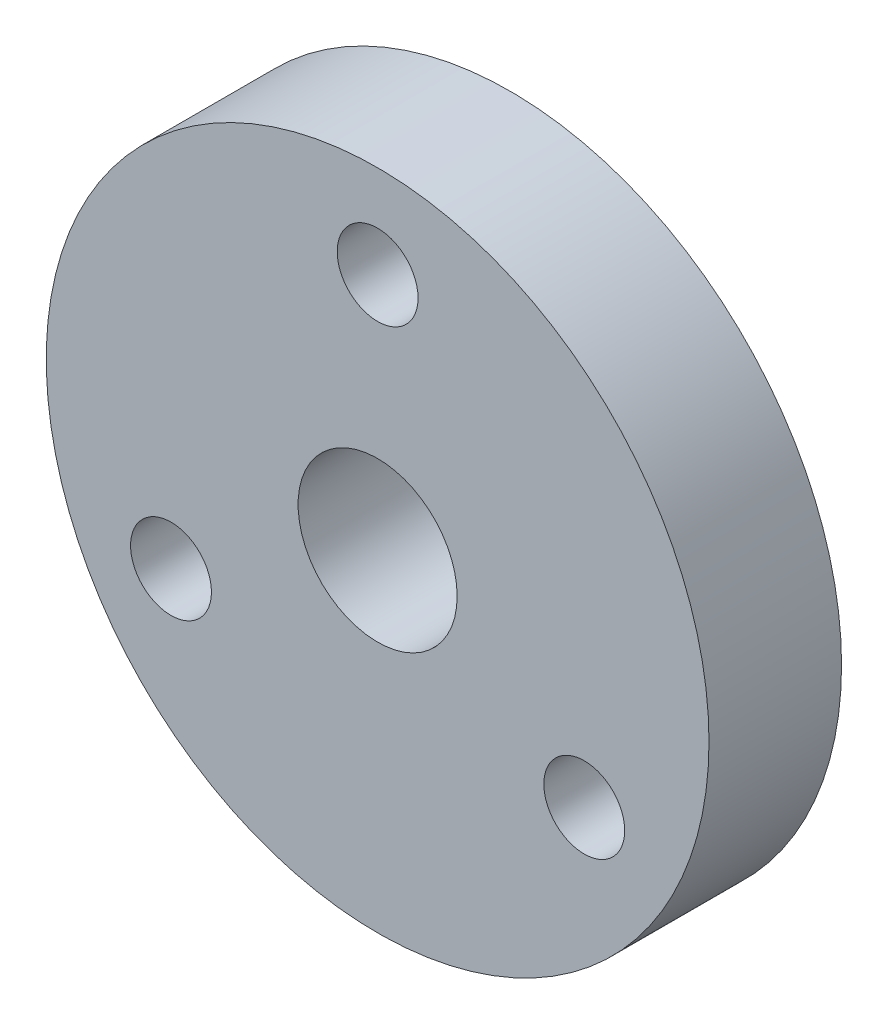
ISO-10303-21;
HEADER;
FILE_DESCRIPTION(('STEP AP214'),'2;1');
FILE_NAME('part.step','',(''),(''),'','','');
FILE_SCHEMA(('AUTOMOTIVE_DESIGN { 1 0 10303 214 1 1 1 1 }'));
ENDSEC;
DATA;
#1=APPLICATION_CONTEXT('core data for automotive mechanical design processes');
#2=APPLICATION_PROTOCOL_DEFINITION('international standard','automotive_design',2000,#1);
#3=PRODUCT_CONTEXT('',#1,'mechanical');
#4=PRODUCT('Part','Part','',(#3));
#5=PRODUCT_RELATED_PRODUCT_CATEGORY('part','',(#4));
#6=PRODUCT_DEFINITION_FORMATION('','',#4);
#7=PRODUCT_DEFINITION_CONTEXT('part definition',#1,'design');
#8=PRODUCT_DEFINITION('design','',#6,#7);
#9=PRODUCT_DEFINITION_SHAPE('','',#8);
#10=(LENGTH_UNIT() NAMED_UNIT(*) SI_UNIT(.MILLI.,.METRE.));
#11=(NAMED_UNIT(*) PLANE_ANGLE_UNIT() SI_UNIT($,.RADIAN.));
#12=(NAMED_UNIT(*) SI_UNIT($,.STERADIAN.) SOLID_ANGLE_UNIT());
#13=UNCERTAINTY_MEASURE_WITH_UNIT(LENGTH_MEASURE(1.E-05),#10,'distance_accuracy_value','');
#14=(GEOMETRIC_REPRESENTATION_CONTEXT(3) GLOBAL_UNCERTAINTY_ASSIGNED_CONTEXT((#13)) GLOBAL_UNIT_ASSIGNED_CONTEXT((#10,
#11,#12)) REPRESENTATION_CONTEXT('',''));
#15=CARTESIAN_POINT('',(0.,0.,0.));
#16=DIRECTION('',(0.,0.,1.));
#17=DIRECTION('',(1.,0.,0.));
#18=AXIS2_PLACEMENT_3D('',#15,#16,#17);
#19=CARTESIAN_POINT('',(0.,0.,5.));
#20=DIRECTION('',(0.,0.,-1.));
#21=DIRECTION('',(-1.,0.,0.));
#22=AXIS2_PLACEMENT_3D('',#19,#20,#21);
#23=CYLINDRICAL_SURFACE('',#22,12.5);
#24=CARTESIAN_POINT('',(0.,0.,5.));
#25=DIRECTION('',(0.,0.,1.));
#26=DIRECTION('',(1.,0.,0.));
#27=AXIS2_PLACEMENT_3D('',#24,#25,#26);
#28=CIRCLE('',#27,12.5);
#29=CARTESIAN_POINT('',(12.5,0.,5.));
#30=VERTEX_POINT('',#29);
#31=EDGE_CURVE('E10',#30,#30,#28,.T.);
#32=ORIENTED_EDGE('',*,*,#31,.F.);
#33=EDGE_LOOP('',(#32));
#34=FACE_BOUND('',#33,.T.);
#35=CARTESIAN_POINT('',(0.,0.,0.));
#36=DIRECTION('',(0.,0.,1.));
#37=DIRECTION('',(1.,0.,0.));
#38=AXIS2_PLACEMENT_3D('',#35,#36,#37);
#39=CIRCLE('',#38,12.5);
#40=CARTESIAN_POINT('',(12.5,0.,0.));
#41=VERTEX_POINT('',#40);
#42=EDGE_CURVE('E33',#41,#41,#39,.T.);
#43=ORIENTED_EDGE('',*,*,#42,.T.);
#44=EDGE_LOOP('',(#43));
#45=FACE_BOUND('',#44,.T.);
#46=ADVANCED_FACE('F30',(#34,#45),#23,.T.);
#47=CARTESIAN_POINT('',(0.,0.,5.));
#48=DIRECTION('',(0.,0.,1.));
#49=DIRECTION('',(1.,0.,0.));
#50=AXIS2_PLACEMENT_3D('',#47,#48,#49);
#51=PLANE('',#50);
#52=CARTESIAN_POINT('',(0.,9.00000000000001,5.));
#53=DIRECTION('',(0.,0.,1.));
#54=DIRECTION('',(1.,0.,0.));
#55=AXIS2_PLACEMENT_3D('',#52,#53,#54);
#56=CIRCLE('',#55,1.525);
#57=CARTESIAN_POINT('',(1.525,9.00000000000001,5.));
#58=VERTEX_POINT('',#57);
#59=EDGE_CURVE('E58',#58,#58,#56,.T.);
#60=ORIENTED_EDGE('',*,*,#59,.F.);
#61=EDGE_LOOP('',(#60));
#62=FACE_BOUND('',#61,.T.);
#63=CARTESIAN_POINT('',(7.79422863405996,-4.49999999999934,5.));
#64=DIRECTION('',(0.,0.,1.));
#65=DIRECTION('',(1.,0.,0.));
#66=AXIS2_PLACEMENT_3D('',#63,#64,#65);
#67=CIRCLE('',#66,1.52500000000058);
#68=CARTESIAN_POINT('',(9.31922863406054,-4.49999999999934,5.));
#69=VERTEX_POINT('',#68);
#70=EDGE_CURVE('E51',#69,#69,#67,.T.);
#71=ORIENTED_EDGE('',*,*,#70,.F.);
#72=EDGE_LOOP('',(#71));
#73=FACE_BOUND('',#72,.T.);
#74=CARTESIAN_POINT('',(-7.79422863405946,-4.49999999999962,5.));
#75=DIRECTION('',(0.,0.,1.));
#76=DIRECTION('',(1.,0.,0.));
#77=AXIS2_PLACEMENT_3D('',#74,#75,#76);
#78=CIRCLE('',#77,1.52500000000024);
#79=CARTESIAN_POINT('',(-6.26922863405922,-4.49999999999962,5.));
#80=VERTEX_POINT('',#79);
#81=EDGE_CURVE('E52',#80,#80,#78,.T.);
#82=ORIENTED_EDGE('',*,*,#81,.F.);
#83=EDGE_LOOP('',(#82));
#84=FACE_BOUND('',#83,.T.);
#85=CARTESIAN_POINT('',(0.,0.,5.));
#86=DIRECTION('',(0.,0.,1.));
#87=DIRECTION('',(1.,0.,0.));
#88=AXIS2_PLACEMENT_3D('',#85,#86,#87);
#89=CIRCLE('',#88,3.);
#90=CARTESIAN_POINT('',(3.,0.,5.));
#91=VERTEX_POINT('',#90);
#92=EDGE_CURVE('E44',#91,#91,#89,.T.);
#93=ORIENTED_EDGE('',*,*,#92,.F.);
#94=EDGE_LOOP('',(#93));
#95=FACE_BOUND('',#94,.T.);
#96=ORIENTED_EDGE('',*,*,#31,.T.);
#97=EDGE_LOOP('',(#96));
#98=FACE_BOUND('',#97,.T.);
#99=ADVANCED_FACE('F69',(#62,#73,#84,#95,#98),#51,.T.);
#100=CARTESIAN_POINT('',(0.,0.,0.));
#101=DIRECTION('',(0.,0.,1.));
#102=DIRECTION('',(1.,0.,0.));
#103=AXIS2_PLACEMENT_3D('',#100,#101,#102);
#104=PLANE('',#103);
#105=CARTESIAN_POINT('',(0.,9.00000000000001,0.));
#106=DIRECTION('',(0.,0.,1.));
#107=DIRECTION('',(1.,0.,0.));
#108=AXIS2_PLACEMENT_3D('',#105,#106,#107);
#109=CIRCLE('',#108,1.525);
#110=CARTESIAN_POINT('',(1.525,9.00000000000001,0.));
#111=VERTEX_POINT('',#110);
#112=EDGE_CURVE('E47',#111,#111,#109,.F.);
#113=ORIENTED_EDGE('',*,*,#112,.F.);
#114=EDGE_LOOP('',(#113));
#115=FACE_BOUND('',#114,.T.);
#116=CARTESIAN_POINT('',(7.79422863405996,-4.49999999999934,0.));
#117=DIRECTION('',(0.,0.,1.));
#118=DIRECTION('',(1.,0.,0.));
#119=AXIS2_PLACEMENT_3D('',#116,#117,#118);
#120=CIRCLE('',#119,1.52500000000058);
#121=CARTESIAN_POINT('',(9.31922863406054,-4.49999999999934,0.));
#122=VERTEX_POINT('',#121);
#123=EDGE_CURVE('E55',#122,#122,#120,.F.);
#124=ORIENTED_EDGE('',*,*,#123,.F.);
#125=EDGE_LOOP('',(#124));
#126=FACE_BOUND('',#125,.T.);
#127=CARTESIAN_POINT('',(-7.79422863405946,-4.49999999999962,0.));
#128=DIRECTION('',(0.,0.,1.));
#129=DIRECTION('',(1.,0.,0.));
#130=AXIS2_PLACEMENT_3D('',#127,#128,#129);
#131=CIRCLE('',#130,1.52500000000024);
#132=CARTESIAN_POINT('',(-6.26922863405922,-4.49999999999962,0.));
#133=VERTEX_POINT('',#132);
#134=EDGE_CURVE('E48',#133,#133,#131,.F.);
#135=ORIENTED_EDGE('',*,*,#134,.F.);
#136=EDGE_LOOP('',(#135));
#137=FACE_BOUND('',#136,.T.);
#138=CARTESIAN_POINT('',(0.,0.,0.));
#139=DIRECTION('',(0.,0.,1.));
#140=DIRECTION('',(1.,0.,0.));
#141=AXIS2_PLACEMENT_3D('',#138,#139,#140);
#142=CIRCLE('',#141,3.);
#143=CARTESIAN_POINT('',(3.,0.,0.));
#144=VERTEX_POINT('',#143);
#145=EDGE_CURVE('E40',#144,#144,#142,.F.);
#146=ORIENTED_EDGE('',*,*,#145,.F.);
#147=EDGE_LOOP('',(#146));
#148=FACE_BOUND('',#147,.T.);
#149=ORIENTED_EDGE('',*,*,#42,.F.);
#150=EDGE_LOOP('',(#149));
#151=FACE_BOUND('',#150,.T.);
#152=ADVANCED_FACE('F72',(#115,#126,#137,#148,#151),#104,.F.);
#153=CARTESIAN_POINT('',(0.,0.,-0.000999999999973245));
#154=DIRECTION('',(0.,0.,1.));
#155=DIRECTION('',(1.,0.,0.));
#156=AXIS2_PLACEMENT_3D('',#153,#154,#155);
#157=CYLINDRICAL_SURFACE('',#156,3.);
#158=ORIENTED_EDGE('',*,*,#92,.T.);
#159=EDGE_LOOP('',(#158));
#160=FACE_BOUND('',#159,.T.);
#161=ORIENTED_EDGE('',*,*,#145,.T.);
#162=EDGE_LOOP('',(#161));
#163=FACE_BOUND('',#162,.T.);
#164=ADVANCED_FACE('F80',(#160,#163),#157,.F.);
#165=CARTESIAN_POINT('',(-7.79422863405946,-4.49999999999962,-0.000999999999973245));
#166=DIRECTION('',(0.,0.,1.));
#167=DIRECTION('',(1.,0.,0.));
#168=AXIS2_PLACEMENT_3D('',#165,#166,#167);
#169=CYLINDRICAL_SURFACE('',#168,1.52500000000024);
#170=ORIENTED_EDGE('',*,*,#81,.T.);
#171=EDGE_LOOP('',(#170));
#172=FACE_BOUND('',#171,.T.);
#173=ORIENTED_EDGE('',*,*,#134,.T.);
#174=EDGE_LOOP('',(#173));
#175=FACE_BOUND('',#174,.T.);
#176=ADVANCED_FACE('F83',(#172,#175),#169,.F.);
#177=CARTESIAN_POINT('',(7.79422863405996,-4.49999999999934,-0.000999999999973245));
#178=DIRECTION('',(0.,0.,1.));
#179=DIRECTION('',(1.,0.,0.));
#180=AXIS2_PLACEMENT_3D('',#177,#178,#179);
#181=CYLINDRICAL_SURFACE('',#180,1.52500000000058);
#182=ORIENTED_EDGE('',*,*,#70,.T.);
#183=EDGE_LOOP('',(#182));
#184=FACE_BOUND('',#183,.T.);
#185=ORIENTED_EDGE('',*,*,#123,.T.);
#186=EDGE_LOOP('',(#185));
#187=FACE_BOUND('',#186,.T.);
#188=ADVANCED_FACE('F114',(#184,#187),#181,.F.);
#189=CARTESIAN_POINT('',(0.,9.00000000000001,-0.000999999999973245));
#190=DIRECTION('',(0.,0.,1.));
#191=DIRECTION('',(1.,0.,0.));
#192=AXIS2_PLACEMENT_3D('',#189,#190,#191);
#193=CYLINDRICAL_SURFACE('',#192,1.525);
#194=ORIENTED_EDGE('',*,*,#59,.T.);
#195=EDGE_LOOP('',(#194));
#196=FACE_BOUND('',#195,.T.);
#197=ORIENTED_EDGE('',*,*,#112,.T.);
#198=EDGE_LOOP('',(#197));
#199=FACE_BOUND('',#198,.T.);
#200=ADVANCED_FACE('F66',(#196,#199),#193,.F.);
#201=CLOSED_SHELL('',(#46,#99,#152,#164,#176,#188,#200));
#202=MANIFOLD_SOLID_BREP('B2',#201);
#203=ADVANCED_BREP_SHAPE_REPRESENTATION('',(#18,#202),#14);
#204=SHAPE_DEFINITION_REPRESENTATION(#9,#203);
ENDSEC;
END-ISO-10303-21;
